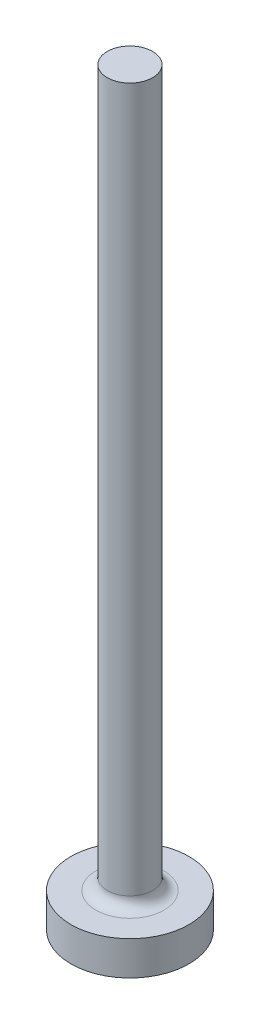
ISO-10303-21;
HEADER;
FILE_DESCRIPTION(('STEP AP214'),'2;1');
FILE_NAME('part.step','',(''),(''),'','','');
FILE_SCHEMA(('AUTOMOTIVE_DESIGN { 1 0 10303 214 1 1 1 1 }'));
ENDSEC;
DATA;
#1=APPLICATION_CONTEXT('core data for automotive mechanical design processes');
#2=APPLICATION_PROTOCOL_DEFINITION('international standard','automotive_design',2000,#1);
#3=PRODUCT_CONTEXT('',#1,'mechanical');
#4=PRODUCT('Part','Part','',(#3));
#5=PRODUCT_RELATED_PRODUCT_CATEGORY('part','',(#4));
#6=PRODUCT_DEFINITION_FORMATION('','',#4);
#7=PRODUCT_DEFINITION_CONTEXT('part definition',#1,'design');
#8=PRODUCT_DEFINITION('design','',#6,#7);
#9=PRODUCT_DEFINITION_SHAPE('','',#8);
#10=(LENGTH_UNIT() NAMED_UNIT(*) SI_UNIT(.MILLI.,.METRE.));
#11=(NAMED_UNIT(*) PLANE_ANGLE_UNIT() SI_UNIT($,.RADIAN.));
#12=(NAMED_UNIT(*) SI_UNIT($,.STERADIAN.) SOLID_ANGLE_UNIT());
#13=UNCERTAINTY_MEASURE_WITH_UNIT(LENGTH_MEASURE(1.E-05),#10,'distance_accuracy_value','');
#14=(GEOMETRIC_REPRESENTATION_CONTEXT(3) GLOBAL_UNCERTAINTY_ASSIGNED_CONTEXT((#13)) GLOBAL_UNIT_ASSIGNED_CONTEXT((#10,
#11,#12)) REPRESENTATION_CONTEXT('',''));
#15=CARTESIAN_POINT('',(0.,0.,0.));
#16=DIRECTION('',(0.,0.,1.));
#17=DIRECTION('',(1.,0.,0.));
#18=AXIS2_PLACEMENT_3D('',#15,#16,#17);
#19=CARTESIAN_POINT('',(0.,1.5,0.));
#20=DIRECTION('',(0.,-1.,0.));
#21=DIRECTION('',(0.,0.,-1.));
#22=AXIS2_PLACEMENT_3D('',#19,#20,#21);
#23=CYLINDRICAL_SURFACE('',#22,2.6);
#24=CARTESIAN_POINT('',(0.,1.5,0.));
#25=DIRECTION('',(0.,1.,0.));
#26=DIRECTION('',(0.,0.,1.));
#27=AXIS2_PLACEMENT_3D('',#24,#25,#26);
#28=CIRCLE('',#27,2.6);
#29=CARTESIAN_POINT('',(0.,1.5,2.6));
#30=VERTEX_POINT('',#29);
#31=EDGE_CURVE('E55',#30,#30,#28,.T.);
#32=ORIENTED_EDGE('',*,*,#31,.F.);
#33=EDGE_LOOP('',(#32));
#34=FACE_BOUND('',#33,.T.);
#35=CARTESIAN_POINT('',(0.,0.,0.));
#36=DIRECTION('',(0.,1.,0.));
#37=DIRECTION('',(0.,0.,1.));
#38=AXIS2_PLACEMENT_3D('',#35,#36,#37);
#39=CIRCLE('',#38,2.6);
#40=CARTESIAN_POINT('',(0.,0.,2.6));
#41=VERTEX_POINT('',#40);
#42=EDGE_CURVE('E60',#41,#41,#39,.T.);
#43=ORIENTED_EDGE('',*,*,#42,.T.);
#44=EDGE_LOOP('',(#43));
#45=FACE_BOUND('',#44,.T.);
#46=ADVANCED_FACE('F42',(#34,#45),#23,.T.);
#47=CARTESIAN_POINT('',(0.,1.5,0.));
#48=DIRECTION('',(0.,1.,0.));
#49=DIRECTION('',(0.,0.,1.));
#50=AXIS2_PLACEMENT_3D('',#47,#48,#49);
#51=PLANE('',#50);
#52=CARTESIAN_POINT('',(0.,1.5,0.));
#53=DIRECTION('',(0.,1.,0.));
#54=DIRECTION('',(0.,0.,1.));
#55=AXIS2_PLACEMENT_3D('',#52,#53,#54);
#56=CIRCLE('',#55,1.5);
#57=CARTESIAN_POINT('',(0.,1.5,1.5));
#58=VERTEX_POINT('',#57);
#59=EDGE_CURVE('E10',#58,#58,#56,.F.);
#60=ORIENTED_EDGE('',*,*,#59,.T.);
#61=EDGE_LOOP('',(#60));
#62=FACE_BOUND('',#61,.T.);
#63=ORIENTED_EDGE('',*,*,#31,.T.);
#64=EDGE_LOOP('',(#63));
#65=FACE_BOUND('',#64,.T.);
#66=ADVANCED_FACE('F84',(#62,#65),#51,.T.);
#67=CARTESIAN_POINT('',(0.,0.,0.));
#68=DIRECTION('',(0.,1.,0.));
#69=DIRECTION('',(0.,0.,1.));
#70=AXIS2_PLACEMENT_3D('',#67,#68,#69);
#71=PLANE('',#70);
#72=ORIENTED_EDGE('',*,*,#42,.F.);
#73=EDGE_LOOP('',(#72));
#74=FACE_BOUND('',#73,.T.);
#75=ADVANCED_FACE('F75',(#74),#71,.F.);
#76=CARTESIAN_POINT('',(0.,33.,0.));
#77=DIRECTION('',(0.,-1.,0.));
#78=DIRECTION('',(0.,0.,-1.));
#79=AXIS2_PLACEMENT_3D('',#76,#77,#78);
#80=CYLINDRICAL_SURFACE('',#79,1.);
#81=CARTESIAN_POINT('',(0.,2.,0.));
#82=DIRECTION('',(0.,1.,0.));
#83=DIRECTION('',(0.,0.,1.));
#84=AXIS2_PLACEMENT_3D('',#81,#82,#83);
#85=CIRCLE('',#84,1.);
#86=CARTESIAN_POINT('',(0.,2.,1.));
#87=VERTEX_POINT('',#86);
#88=EDGE_CURVE('E50',#87,#87,#85,.T.);
#89=ORIENTED_EDGE('',*,*,#88,.T.);
#90=EDGE_LOOP('',(#89));
#91=FACE_BOUND('',#90,.T.);
#92=CARTESIAN_POINT('',(0.,33.,0.));
#93=DIRECTION('',(0.,1.,0.));
#94=DIRECTION('',(0.,0.,1.));
#95=AXIS2_PLACEMENT_3D('',#92,#93,#94);
#96=CIRCLE('',#95,1.);
#97=CARTESIAN_POINT('',(0.,33.,1.));
#98=VERTEX_POINT('',#97);
#99=EDGE_CURVE('E65',#98,#98,#96,.T.);
#100=ORIENTED_EDGE('',*,*,#99,.F.);
#101=EDGE_LOOP('',(#100));
#102=FACE_BOUND('',#101,.T.);
#103=ADVANCED_FACE('F73',(#91,#102),#80,.T.);
#104=CARTESIAN_POINT('',(0.,33.,0.));
#105=DIRECTION('',(0.,1.,0.));
#106=DIRECTION('',(0.,0.,1.));
#107=AXIS2_PLACEMENT_3D('',#104,#105,#106);
#108=PLANE('',#107);
#109=ORIENTED_EDGE('',*,*,#99,.T.);
#110=EDGE_LOOP('',(#109));
#111=FACE_BOUND('',#110,.T.);
#112=ADVANCED_FACE('F71',(#111),#108,.T.);
#113=CARTESIAN_POINT('',(0.,2.,0.));
#114=DIRECTION('',(0.,1.,0.));
#115=DIRECTION('',(0.,0.,1.));
#116=AXIS2_PLACEMENT_3D('',#113,#114,#115);
#117=TOROIDAL_SURFACE('',#116,1.5,0.5);
#118=ORIENTED_EDGE('',*,*,#59,.F.);
#119=EDGE_LOOP('',(#118));
#120=FACE_BOUND('',#119,.T.);
#121=ORIENTED_EDGE('',*,*,#88,.F.);
#122=EDGE_LOOP('',(#121));
#123=FACE_BOUND('',#122,.T.);
#124=ADVANCED_FACE('F44',(#120,#123),#117,.F.);
#125=CLOSED_SHELL('',(#46,#66,#75,#103,#112,#124));
#126=MANIFOLD_SOLID_BREP('B2',#125);
#127=ADVANCED_BREP_SHAPE_REPRESENTATION('',(#18,#126),#14);
#128=SHAPE_DEFINITION_REPRESENTATION(#9,#127);
ENDSEC;
END-ISO-10303-21;
